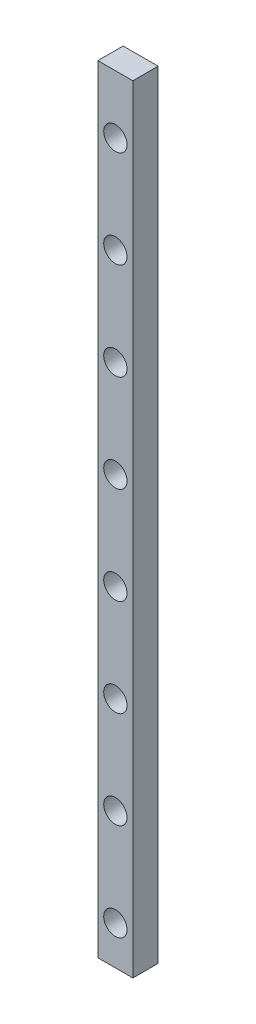
ISO-10303-21;
HEADER;
FILE_DESCRIPTION(('STEP AP214'),'2;1');
FILE_NAME('part.step','',(''),(''),'','','');
FILE_SCHEMA(('AUTOMOTIVE_DESIGN { 1 0 10303 214 1 1 1 1 }'));
ENDSEC;
DATA;
#1=APPLICATION_CONTEXT('core data for automotive mechanical design processes');
#2=APPLICATION_PROTOCOL_DEFINITION('international standard','automotive_design',2000,#1);
#3=PRODUCT_CONTEXT('',#1,'mechanical');
#4=PRODUCT('Part','Part','',(#3));
#5=PRODUCT_RELATED_PRODUCT_CATEGORY('part','',(#4));
#6=PRODUCT_DEFINITION_FORMATION('','',#4);
#7=PRODUCT_DEFINITION_CONTEXT('part definition',#1,'design');
#8=PRODUCT_DEFINITION('design','',#6,#7);
#9=PRODUCT_DEFINITION_SHAPE('','',#8);
#10=(LENGTH_UNIT() NAMED_UNIT(*) SI_UNIT(.MILLI.,.METRE.));
#11=(NAMED_UNIT(*) PLANE_ANGLE_UNIT() SI_UNIT($,.RADIAN.));
#12=(NAMED_UNIT(*) SI_UNIT($,.STERADIAN.) SOLID_ANGLE_UNIT());
#13=UNCERTAINTY_MEASURE_WITH_UNIT(LENGTH_MEASURE(1.E-05),#10,'distance_accuracy_value','');
#14=(GEOMETRIC_REPRESENTATION_CONTEXT(3) GLOBAL_UNCERTAINTY_ASSIGNED_CONTEXT((#13)) GLOBAL_UNIT_ASSIGNED_CONTEXT((#10,
#11,#12)) REPRESENTATION_CONTEXT('',''));
#15=CARTESIAN_POINT('',(0.,0.,0.));
#16=DIRECTION('',(0.,0.,1.));
#17=DIRECTION('',(1.,0.,0.));
#18=AXIS2_PLACEMENT_3D('',#15,#16,#17);
#19=CARTESIAN_POINT('',(-4.5,200.,3.25));
#20=DIRECTION('',(1.,0.,0.));
#21=DIRECTION('',(0.,0.,-1.));
#22=AXIS2_PLACEMENT_3D('',#19,#20,#21);
#23=PLANE('',#22);
#24=DIRECTION('',(0.,0.,1.));
#25=VECTOR('',#24,1.);
#26=CARTESIAN_POINT('',(-4.5,0.,3.25));
#27=LINE('',#26,#25);
#28=CARTESIAN_POINT('',(-4.5,0.,-3.25));
#29=VERTEX_POINT('',#28);
#30=CARTESIAN_POINT('',(-4.5,0.,3.25));
#31=VERTEX_POINT('',#30);
#32=EDGE_CURVE('E104',#29,#31,#27,.T.);
#33=ORIENTED_EDGE('',*,*,#32,.T.);
#34=DIRECTION('',(0.,-1.,0.));
#35=VECTOR('',#34,1.);
#36=CARTESIAN_POINT('',(-4.5,200.,3.25));
#37=LINE('',#36,#35);
#38=CARTESIAN_POINT('',(-4.5,200.,3.25));
#39=VERTEX_POINT('',#38);
#40=EDGE_CURVE('E11',#39,#31,#37,.T.);
#41=ORIENTED_EDGE('',*,*,#40,.F.);
#42=DIRECTION('',(0.,0.,1.));
#43=VECTOR('',#42,1.);
#44=CARTESIAN_POINT('',(-4.5,200.,3.25));
#45=LINE('',#44,#43);
#46=CARTESIAN_POINT('',(-4.5,200.,-3.25));
#47=VERTEX_POINT('',#46);
#48=EDGE_CURVE('E91',#47,#39,#45,.T.);
#49=ORIENTED_EDGE('',*,*,#48,.F.);
#50=DIRECTION('',(0.,-1.,0.));
#51=VECTOR('',#50,1.);
#52=CARTESIAN_POINT('',(-4.5,200.,-3.25));
#53=LINE('',#52,#51);
#54=EDGE_CURVE('E100',#47,#29,#53,.T.);
#55=ORIENTED_EDGE('',*,*,#54,.T.);
#56=EDGE_LOOP('',(#33,#41,#49,#55));
#57=FACE_BOUND('',#56,.T.);
#58=ADVANCED_FACE('F39',(#57),#23,.F.);
#59=CARTESIAN_POINT('',(4.5,200.,3.25));
#60=DIRECTION('',(0.,0.,-1.));
#61=DIRECTION('',(-1.,0.,0.));
#62=AXIS2_PLACEMENT_3D('',#59,#60,#61);
#63=PLANE('',#62);
#64=CARTESIAN_POINT('',(0.,185.,3.25));
#65=DIRECTION('',(0.,0.,1.));
#66=DIRECTION('',(1.,0.,0.));
#67=AXIS2_PLACEMENT_3D('',#64,#65,#66);
#68=CIRCLE('',#67,3.);
#69=CARTESIAN_POINT('',(3.,185.,3.25));
#70=VERTEX_POINT('',#69);
#71=EDGE_CURVE('E204',#70,#70,#68,.T.);
#72=ORIENTED_EDGE('',*,*,#71,.F.);
#73=EDGE_LOOP('',(#72));
#74=FACE_BOUND('',#73,.T.);
#75=CARTESIAN_POINT('',(0.,160.,3.25));
#76=DIRECTION('',(0.,0.,1.));
#77=DIRECTION('',(1.,0.,0.));
#78=AXIS2_PLACEMENT_3D('',#75,#76,#77);
#79=CIRCLE('',#78,3.);
#80=CARTESIAN_POINT('',(3.,160.,3.25));
#81=VERTEX_POINT('',#80);
#82=EDGE_CURVE('E192',#81,#81,#79,.T.);
#83=ORIENTED_EDGE('',*,*,#82,.F.);
#84=EDGE_LOOP('',(#83));
#85=FACE_BOUND('',#84,.T.);
#86=CARTESIAN_POINT('',(0.,135.,3.25));
#87=DIRECTION('',(0.,0.,1.));
#88=DIRECTION('',(1.,0.,0.));
#89=AXIS2_PLACEMENT_3D('',#86,#87,#88);
#90=CIRCLE('',#89,3.);
#91=CARTESIAN_POINT('',(3.,135.,3.25));
#92=VERTEX_POINT('',#91);
#93=EDGE_CURVE('E180',#92,#92,#90,.T.);
#94=ORIENTED_EDGE('',*,*,#93,.F.);
#95=EDGE_LOOP('',(#94));
#96=FACE_BOUND('',#95,.T.);
#97=CARTESIAN_POINT('',(0.,110.,3.25));
#98=DIRECTION('',(0.,0.,1.));
#99=DIRECTION('',(1.,0.,0.));
#100=AXIS2_PLACEMENT_3D('',#97,#98,#99);
#101=CIRCLE('',#100,3.);
#102=CARTESIAN_POINT('',(3.,110.,3.25));
#103=VERTEX_POINT('',#102);
#104=EDGE_CURVE('E168',#103,#103,#101,.T.);
#105=ORIENTED_EDGE('',*,*,#104,.F.);
#106=EDGE_LOOP('',(#105));
#107=FACE_BOUND('',#106,.T.);
#108=CARTESIAN_POINT('',(0.,85.,3.25));
#109=DIRECTION('',(0.,0.,1.));
#110=DIRECTION('',(1.,0.,0.));
#111=AXIS2_PLACEMENT_3D('',#108,#109,#110);
#112=CIRCLE('',#111,3.);
#113=CARTESIAN_POINT('',(3.,85.,3.25));
#114=VERTEX_POINT('',#113);
#115=EDGE_CURVE('E156',#114,#114,#112,.T.);
#116=ORIENTED_EDGE('',*,*,#115,.F.);
#117=EDGE_LOOP('',(#116));
#118=FACE_BOUND('',#117,.T.);
#119=CARTESIAN_POINT('',(0.,60.,3.25));
#120=DIRECTION('',(0.,0.,1.));
#121=DIRECTION('',(1.,0.,0.));
#122=AXIS2_PLACEMENT_3D('',#119,#120,#121);
#123=CIRCLE('',#122,3.);
#124=CARTESIAN_POINT('',(3.,60.,3.25));
#125=VERTEX_POINT('',#124);
#126=EDGE_CURVE('E144',#125,#125,#123,.T.);
#127=ORIENTED_EDGE('',*,*,#126,.F.);
#128=EDGE_LOOP('',(#127));
#129=FACE_BOUND('',#128,.T.);
#130=CARTESIAN_POINT('',(0.,35.,3.25));
#131=DIRECTION('',(0.,0.,1.));
#132=DIRECTION('',(1.,0.,0.));
#133=AXIS2_PLACEMENT_3D('',#130,#131,#132);
#134=CIRCLE('',#133,3.);
#135=CARTESIAN_POINT('',(3.,35.,3.25));
#136=VERTEX_POINT('',#135);
#137=EDGE_CURVE('E132',#136,#136,#134,.T.);
#138=ORIENTED_EDGE('',*,*,#137,.F.);
#139=EDGE_LOOP('',(#138));
#140=FACE_BOUND('',#139,.T.);
#141=CARTESIAN_POINT('',(0.,10.,3.25));
#142=DIRECTION('',(0.,0.,1.));
#143=DIRECTION('',(1.,0.,0.));
#144=AXIS2_PLACEMENT_3D('',#141,#142,#143);
#145=CIRCLE('',#144,3.);
#146=CARTESIAN_POINT('',(3.,10.,3.25));
#147=VERTEX_POINT('',#146);
#148=EDGE_CURVE('E118',#147,#147,#145,.T.);
#149=ORIENTED_EDGE('',*,*,#148,.F.);
#150=EDGE_LOOP('',(#149));
#151=FACE_BOUND('',#150,.T.);
#152=DIRECTION('',(1.,0.,0.));
#153=VECTOR('',#152,1.);
#154=CARTESIAN_POINT('',(4.5,0.,3.25));
#155=LINE('',#154,#153);
#156=CARTESIAN_POINT('',(4.5,0.,3.25));
#157=VERTEX_POINT('',#156);
#158=EDGE_CURVE('E95',#31,#157,#155,.T.);
#159=ORIENTED_EDGE('',*,*,#158,.T.);
#160=DIRECTION('',(0.,-1.,0.));
#161=VECTOR('',#160,1.);
#162=CARTESIAN_POINT('',(4.5,200.,3.25));
#163=LINE('',#162,#161);
#164=CARTESIAN_POINT('',(4.5,200.,3.25));
#165=VERTEX_POINT('',#164);
#166=EDGE_CURVE('E48',#165,#157,#163,.T.);
#167=ORIENTED_EDGE('',*,*,#166,.F.);
#168=DIRECTION('',(1.,0.,0.));
#169=VECTOR('',#168,1.);
#170=CARTESIAN_POINT('',(4.5,200.,3.25));
#171=LINE('',#170,#169);
#172=EDGE_CURVE('E86',#39,#165,#171,.T.);
#173=ORIENTED_EDGE('',*,*,#172,.F.);
#174=ORIENTED_EDGE('',*,*,#40,.T.);
#175=EDGE_LOOP('',(#159,#167,#173,#174));
#176=FACE_BOUND('',#175,.T.);
#177=ADVANCED_FACE('F94',(#74,#85,#96,#107,#118,#129,#140,#151,#176),#63,.F.);
#178=CARTESIAN_POINT('',(4.5,200.,3.25));
#179=DIRECTION('',(-1.,0.,0.));
#180=DIRECTION('',(0.,0.,1.));
#181=AXIS2_PLACEMENT_3D('',#178,#179,#180);
#182=PLANE('',#181);
#183=DIRECTION('',(0.,0.,-1.));
#184=VECTOR('',#183,1.);
#185=CARTESIAN_POINT('',(4.5,0.,3.25));
#186=LINE('',#185,#184);
#187=CARTESIAN_POINT('',(4.5,0.,-3.25));
#188=VERTEX_POINT('',#187);
#189=EDGE_CURVE('E73',#157,#188,#186,.T.);
#190=ORIENTED_EDGE('',*,*,#189,.T.);
#191=DIRECTION('',(0.,-1.,0.));
#192=VECTOR('',#191,1.);
#193=CARTESIAN_POINT('',(4.5,200.,-3.25));
#194=LINE('',#193,#192);
#195=CARTESIAN_POINT('',(4.5,200.,-3.25));
#196=VERTEX_POINT('',#195);
#197=EDGE_CURVE('E96',#196,#188,#194,.T.);
#198=ORIENTED_EDGE('',*,*,#197,.F.);
#199=DIRECTION('',(0.,0.,-1.));
#200=VECTOR('',#199,1.);
#201=CARTESIAN_POINT('',(4.5,200.,3.25));
#202=LINE('',#201,#200);
#203=EDGE_CURVE('E89',#165,#196,#202,.T.);
#204=ORIENTED_EDGE('',*,*,#203,.F.);
#205=ORIENTED_EDGE('',*,*,#166,.T.);
#206=EDGE_LOOP('',(#190,#198,#204,#205));
#207=FACE_BOUND('',#206,.T.);
#208=ADVANCED_FACE('F98',(#207),#182,.F.);
#209=CARTESIAN_POINT('',(4.5,200.,-3.25));
#210=DIRECTION('',(0.,0.,1.));
#211=DIRECTION('',(1.,0.,0.));
#212=AXIS2_PLACEMENT_3D('',#209,#210,#211);
#213=PLANE('',#212);
#214=CARTESIAN_POINT('',(0.,185.,-3.25));
#215=DIRECTION('',(0.,0.,1.));
#216=DIRECTION('',(1.,0.,0.));
#217=AXIS2_PLACEMENT_3D('',#214,#215,#216);
#218=CIRCLE('',#217,1.75);
#219=CARTESIAN_POINT('',(1.75,185.,-3.25));
#220=VERTEX_POINT('',#219);
#221=EDGE_CURVE('E207',#220,#220,#218,.T.);
#222=ORIENTED_EDGE('',*,*,#221,.T.);
#223=EDGE_LOOP('',(#222));
#224=FACE_BOUND('',#223,.T.);
#225=CARTESIAN_POINT('',(0.,160.,-3.25));
#226=DIRECTION('',(0.,0.,1.));
#227=DIRECTION('',(1.,0.,0.));
#228=AXIS2_PLACEMENT_3D('',#225,#226,#227);
#229=CIRCLE('',#228,1.75);
#230=CARTESIAN_POINT('',(1.75,160.,-3.25));
#231=VERTEX_POINT('',#230);
#232=EDGE_CURVE('E195',#231,#231,#229,.T.);
#233=ORIENTED_EDGE('',*,*,#232,.T.);
#234=EDGE_LOOP('',(#233));
#235=FACE_BOUND('',#234,.T.);
#236=CARTESIAN_POINT('',(0.,135.,-3.25));
#237=DIRECTION('',(0.,0.,1.));
#238=DIRECTION('',(1.,0.,0.));
#239=AXIS2_PLACEMENT_3D('',#236,#237,#238);
#240=CIRCLE('',#239,1.75);
#241=CARTESIAN_POINT('',(1.75,135.,-3.25));
#242=VERTEX_POINT('',#241);
#243=EDGE_CURVE('E183',#242,#242,#240,.T.);
#244=ORIENTED_EDGE('',*,*,#243,.T.);
#245=EDGE_LOOP('',(#244));
#246=FACE_BOUND('',#245,.T.);
#247=CARTESIAN_POINT('',(0.,110.,-3.25));
#248=DIRECTION('',(0.,0.,1.));
#249=DIRECTION('',(1.,0.,0.));
#250=AXIS2_PLACEMENT_3D('',#247,#248,#249);
#251=CIRCLE('',#250,1.75);
#252=CARTESIAN_POINT('',(1.75,110.,-3.25));
#253=VERTEX_POINT('',#252);
#254=EDGE_CURVE('E171',#253,#253,#251,.T.);
#255=ORIENTED_EDGE('',*,*,#254,.T.);
#256=EDGE_LOOP('',(#255));
#257=FACE_BOUND('',#256,.T.);
#258=CARTESIAN_POINT('',(0.,85.,-3.25));
#259=DIRECTION('',(0.,0.,1.));
#260=DIRECTION('',(1.,0.,0.));
#261=AXIS2_PLACEMENT_3D('',#258,#259,#260);
#262=CIRCLE('',#261,1.75);
#263=CARTESIAN_POINT('',(1.75,85.,-3.25));
#264=VERTEX_POINT('',#263);
#265=EDGE_CURVE('E159',#264,#264,#262,.T.);
#266=ORIENTED_EDGE('',*,*,#265,.T.);
#267=EDGE_LOOP('',(#266));
#268=FACE_BOUND('',#267,.T.);
#269=CARTESIAN_POINT('',(0.,60.,-3.25));
#270=DIRECTION('',(0.,0.,1.));
#271=DIRECTION('',(1.,0.,0.));
#272=AXIS2_PLACEMENT_3D('',#269,#270,#271);
#273=CIRCLE('',#272,1.75);
#274=CARTESIAN_POINT('',(1.75,60.,-3.25));
#275=VERTEX_POINT('',#274);
#276=EDGE_CURVE('E147',#275,#275,#273,.T.);
#277=ORIENTED_EDGE('',*,*,#276,.T.);
#278=EDGE_LOOP('',(#277));
#279=FACE_BOUND('',#278,.T.);
#280=CARTESIAN_POINT('',(0.,35.,-3.25));
#281=DIRECTION('',(0.,0.,1.));
#282=DIRECTION('',(1.,0.,0.));
#283=AXIS2_PLACEMENT_3D('',#280,#281,#282);
#284=CIRCLE('',#283,1.75);
#285=CARTESIAN_POINT('',(1.75,35.,-3.25));
#286=VERTEX_POINT('',#285);
#287=EDGE_CURVE('E135',#286,#286,#284,.T.);
#288=ORIENTED_EDGE('',*,*,#287,.T.);
#289=EDGE_LOOP('',(#288));
#290=FACE_BOUND('',#289,.T.);
#291=CARTESIAN_POINT('',(0.,10.,-3.25));
#292=DIRECTION('',(0.,0.,1.));
#293=DIRECTION('',(1.,0.,0.));
#294=AXIS2_PLACEMENT_3D('',#291,#292,#293);
#295=CIRCLE('',#294,1.75);
#296=CARTESIAN_POINT('',(1.75,10.,-3.25));
#297=VERTEX_POINT('',#296);
#298=EDGE_CURVE('E42',#297,#297,#295,.T.);
#299=ORIENTED_EDGE('',*,*,#298,.T.);
#300=EDGE_LOOP('',(#299));
#301=FACE_BOUND('',#300,.T.);
#302=DIRECTION('',(-1.,0.,0.));
#303=VECTOR('',#302,1.);
#304=CARTESIAN_POINT('',(4.5,0.,-3.25));
#305=LINE('',#304,#303);
#306=EDGE_CURVE('E79',#188,#29,#305,.T.);
#307=ORIENTED_EDGE('',*,*,#306,.T.);
#308=ORIENTED_EDGE('',*,*,#54,.F.);
#309=DIRECTION('',(-1.,0.,0.));
#310=VECTOR('',#309,1.);
#311=CARTESIAN_POINT('',(4.5,200.,-3.25));
#312=LINE('',#311,#310);
#313=EDGE_CURVE('E56',#196,#47,#312,.T.);
#314=ORIENTED_EDGE('',*,*,#313,.F.);
#315=ORIENTED_EDGE('',*,*,#197,.T.);
#316=EDGE_LOOP('',(#307,#308,#314,#315));
#317=FACE_BOUND('',#316,.T.);
#318=ADVANCED_FACE('F112',(#224,#235,#246,#257,#268,#279,#290,#301,#317),#213,.F.);
#319=CARTESIAN_POINT('',(0.,200.,0.));
#320=DIRECTION('',(0.,1.,0.));
#321=DIRECTION('',(0.,0.,1.));
#322=AXIS2_PLACEMENT_3D('',#319,#320,#321);
#323=PLANE('',#322);
#324=ORIENTED_EDGE('',*,*,#48,.T.);
#325=ORIENTED_EDGE('',*,*,#172,.T.);
#326=ORIENTED_EDGE('',*,*,#203,.T.);
#327=ORIENTED_EDGE('',*,*,#313,.T.);
#328=EDGE_LOOP('',(#324,#325,#326,#327));
#329=FACE_BOUND('',#328,.T.);
#330=ADVANCED_FACE('F87',(#329),#323,.T.);
#331=CARTESIAN_POINT('',(0.,0.,0.));
#332=DIRECTION('',(0.,1.,0.));
#333=DIRECTION('',(0.,0.,1.));
#334=AXIS2_PLACEMENT_3D('',#331,#332,#333);
#335=PLANE('',#334);
#336=ORIENTED_EDGE('',*,*,#32,.F.);
#337=ORIENTED_EDGE('',*,*,#306,.F.);
#338=ORIENTED_EDGE('',*,*,#189,.F.);
#339=ORIENTED_EDGE('',*,*,#158,.F.);
#340=EDGE_LOOP('',(#336,#337,#338,#339));
#341=FACE_BOUND('',#340,.T.);
#342=ADVANCED_FACE('F115',(#341),#335,.F.);
#343=CARTESIAN_POINT('',(0.,10.,-1.25));
#344=DIRECTION('',(0.,0.,1.));
#345=DIRECTION('',(1.,0.,0.));
#346=AXIS2_PLACEMENT_3D('',#343,#344,#345);
#347=CYLINDRICAL_SURFACE('',#346,3.);
#348=CARTESIAN_POINT('',(0.,10.,-1.25));
#349=DIRECTION('',(0.,0.,1.));
#350=DIRECTION('',(1.,0.,0.));
#351=AXIS2_PLACEMENT_3D('',#348,#349,#350);
#352=CIRCLE('',#351,3.);
#353=CARTESIAN_POINT('',(3.,10.,-1.25));
#354=VERTEX_POINT('',#353);
#355=EDGE_CURVE('E107',#354,#354,#352,.T.);
#356=ORIENTED_EDGE('',*,*,#355,.F.);
#357=EDGE_LOOP('',(#356));
#358=FACE_BOUND('',#357,.T.);
#359=ORIENTED_EDGE('',*,*,#148,.T.);
#360=EDGE_LOOP('',(#359));
#361=FACE_BOUND('',#360,.T.);
#362=ADVANCED_FACE('F241',(#358,#361),#347,.F.);
#363=CARTESIAN_POINT('',(0.,10.,-1.25));
#364=DIRECTION('',(0.,0.,1.));
#365=DIRECTION('',(1.,0.,0.));
#366=AXIS2_PLACEMENT_3D('',#363,#364,#365);
#367=PLANE('',#366);
#368=CARTESIAN_POINT('',(0.,10.,-1.25));
#369=DIRECTION('',(0.,0.,1.));
#370=DIRECTION('',(1.,0.,0.));
#371=AXIS2_PLACEMENT_3D('',#368,#369,#370);
#372=CIRCLE('',#371,1.75);
#373=CARTESIAN_POINT('',(1.75,10.,-1.25));
#374=VERTEX_POINT('',#373);
#375=EDGE_CURVE('E123',#374,#374,#372,.T.);
#376=ORIENTED_EDGE('',*,*,#375,.F.);
#377=EDGE_LOOP('',(#376));
#378=FACE_BOUND('',#377,.T.);
#379=ORIENTED_EDGE('',*,*,#355,.T.);
#380=EDGE_LOOP('',(#379));
#381=FACE_BOUND('',#380,.T.);
#382=ADVANCED_FACE('F246',(#378,#381),#367,.T.);
#383=CARTESIAN_POINT('',(0.,10.,-5.75));
#384=DIRECTION('',(0.,0.,1.));
#385=DIRECTION('',(1.,0.,0.));
#386=AXIS2_PLACEMENT_3D('',#383,#384,#385);
#387=CYLINDRICAL_SURFACE('',#386,1.75);
#388=ORIENTED_EDGE('',*,*,#375,.T.);
#389=EDGE_LOOP('',(#388));
#390=FACE_BOUND('',#389,.T.);
#391=ORIENTED_EDGE('',*,*,#298,.F.);
#392=EDGE_LOOP('',(#391));
#393=FACE_BOUND('',#392,.T.);
#394=ADVANCED_FACE('F250',(#390,#393),#387,.F.);
#395=CARTESIAN_POINT('',(0.,35.,-1.25));
#396=DIRECTION('',(0.,0.,1.));
#397=DIRECTION('',(1.,0.,0.));
#398=AXIS2_PLACEMENT_3D('',#395,#396,#397);
#399=CYLINDRICAL_SURFACE('',#398,3.);
#400=CARTESIAN_POINT('',(0.,35.,-1.25));
#401=DIRECTION('',(0.,0.,1.));
#402=DIRECTION('',(1.,0.,0.));
#403=AXIS2_PLACEMENT_3D('',#400,#401,#402);
#404=CIRCLE('',#403,3.);
#405=CARTESIAN_POINT('',(3.,35.,-1.25));
#406=VERTEX_POINT('',#405);
#407=EDGE_CURVE('E126',#406,#406,#404,.T.);
#408=ORIENTED_EDGE('',*,*,#407,.F.);
#409=EDGE_LOOP('',(#408));
#410=FACE_BOUND('',#409,.T.);
#411=ORIENTED_EDGE('',*,*,#137,.T.);
#412=EDGE_LOOP('',(#411));
#413=FACE_BOUND('',#412,.T.);
#414=ADVANCED_FACE('F253',(#410,#413),#399,.F.);
#415=CARTESIAN_POINT('',(0.,35.,-1.25));
#416=DIRECTION('',(0.,0.,1.));
#417=DIRECTION('',(1.,0.,0.));
#418=AXIS2_PLACEMENT_3D('',#415,#416,#417);
#419=PLANE('',#418);
#420=CARTESIAN_POINT('',(0.,35.,-1.25));
#421=DIRECTION('',(0.,0.,1.));
#422=DIRECTION('',(1.,0.,0.));
#423=AXIS2_PLACEMENT_3D('',#420,#421,#422);
#424=CIRCLE('',#423,1.75);
#425=CARTESIAN_POINT('',(1.75,35.,-1.25));
#426=VERTEX_POINT('',#425);
#427=EDGE_CURVE('E129',#426,#426,#424,.T.);
#428=ORIENTED_EDGE('',*,*,#427,.F.);
#429=EDGE_LOOP('',(#428));
#430=FACE_BOUND('',#429,.T.);
#431=ORIENTED_EDGE('',*,*,#407,.T.);
#432=EDGE_LOOP('',(#431));
#433=FACE_BOUND('',#432,.T.);
#434=ADVANCED_FACE('F257',(#430,#433),#419,.T.);
#435=CARTESIAN_POINT('',(0.,35.,-5.75));
#436=DIRECTION('',(0.,0.,1.));
#437=DIRECTION('',(1.,0.,0.));
#438=AXIS2_PLACEMENT_3D('',#435,#436,#437);
#439=CYLINDRICAL_SURFACE('',#438,1.75);
#440=ORIENTED_EDGE('',*,*,#427,.T.);
#441=EDGE_LOOP('',(#440));
#442=FACE_BOUND('',#441,.T.);
#443=ORIENTED_EDGE('',*,*,#287,.F.);
#444=EDGE_LOOP('',(#443));
#445=FACE_BOUND('',#444,.T.);
#446=ADVANCED_FACE('F261',(#442,#445),#439,.F.);
#447=CARTESIAN_POINT('',(0.,60.,-1.25));
#448=DIRECTION('',(0.,0.,1.));
#449=DIRECTION('',(1.,0.,0.));
#450=AXIS2_PLACEMENT_3D('',#447,#448,#449);
#451=CYLINDRICAL_SURFACE('',#450,3.);
#452=CARTESIAN_POINT('',(0.,60.,-1.25));
#453=DIRECTION('',(0.,0.,1.));
#454=DIRECTION('',(1.,0.,0.));
#455=AXIS2_PLACEMENT_3D('',#452,#453,#454);
#456=CIRCLE('',#455,3.);
#457=CARTESIAN_POINT('',(3.,60.,-1.25));
#458=VERTEX_POINT('',#457);
#459=EDGE_CURVE('E138',#458,#458,#456,.T.);
#460=ORIENTED_EDGE('',*,*,#459,.F.);
#461=EDGE_LOOP('',(#460));
#462=FACE_BOUND('',#461,.T.);
#463=ORIENTED_EDGE('',*,*,#126,.T.);
#464=EDGE_LOOP('',(#463));
#465=FACE_BOUND('',#464,.T.);
#466=ADVANCED_FACE('F265',(#462,#465),#451,.F.);
#467=CARTESIAN_POINT('',(0.,60.,-1.25));
#468=DIRECTION('',(0.,0.,1.));
#469=DIRECTION('',(1.,0.,0.));
#470=AXIS2_PLACEMENT_3D('',#467,#468,#469);
#471=PLANE('',#470);
#472=CARTESIAN_POINT('',(0.,60.,-1.25));
#473=DIRECTION('',(0.,0.,1.));
#474=DIRECTION('',(1.,0.,0.));
#475=AXIS2_PLACEMENT_3D('',#472,#473,#474);
#476=CIRCLE('',#475,1.75);
#477=CARTESIAN_POINT('',(1.75,60.,-1.25));
#478=VERTEX_POINT('',#477);
#479=EDGE_CURVE('E141',#478,#478,#476,.T.);
#480=ORIENTED_EDGE('',*,*,#479,.F.);
#481=EDGE_LOOP('',(#480));
#482=FACE_BOUND('',#481,.T.);
#483=ORIENTED_EDGE('',*,*,#459,.T.);
#484=EDGE_LOOP('',(#483));
#485=FACE_BOUND('',#484,.T.);
#486=ADVANCED_FACE('F269',(#482,#485),#471,.T.);
#487=CARTESIAN_POINT('',(0.,60.,-5.75));
#488=DIRECTION('',(0.,0.,1.));
#489=DIRECTION('',(1.,0.,0.));
#490=AXIS2_PLACEMENT_3D('',#487,#488,#489);
#491=CYLINDRICAL_SURFACE('',#490,1.75);
#492=ORIENTED_EDGE('',*,*,#479,.T.);
#493=EDGE_LOOP('',(#492));
#494=FACE_BOUND('',#493,.T.);
#495=ORIENTED_EDGE('',*,*,#276,.F.);
#496=EDGE_LOOP('',(#495));
#497=FACE_BOUND('',#496,.T.);
#498=ADVANCED_FACE('F273',(#494,#497),#491,.F.);
#499=CARTESIAN_POINT('',(0.,85.,-1.25));
#500=DIRECTION('',(0.,0.,1.));
#501=DIRECTION('',(1.,0.,0.));
#502=AXIS2_PLACEMENT_3D('',#499,#500,#501);
#503=CYLINDRICAL_SURFACE('',#502,3.);
#504=CARTESIAN_POINT('',(0.,85.,-1.25));
#505=DIRECTION('',(0.,0.,1.));
#506=DIRECTION('',(1.,0.,0.));
#507=AXIS2_PLACEMENT_3D('',#504,#505,#506);
#508=CIRCLE('',#507,3.);
#509=CARTESIAN_POINT('',(3.,85.,-1.25));
#510=VERTEX_POINT('',#509);
#511=EDGE_CURVE('E150',#510,#510,#508,.T.);
#512=ORIENTED_EDGE('',*,*,#511,.F.);
#513=EDGE_LOOP('',(#512));
#514=FACE_BOUND('',#513,.T.);
#515=ORIENTED_EDGE('',*,*,#115,.T.);
#516=EDGE_LOOP('',(#515));
#517=FACE_BOUND('',#516,.T.);
#518=ADVANCED_FACE('F277',(#514,#517),#503,.F.);
#519=CARTESIAN_POINT('',(0.,85.,-1.25));
#520=DIRECTION('',(0.,0.,1.));
#521=DIRECTION('',(1.,0.,0.));
#522=AXIS2_PLACEMENT_3D('',#519,#520,#521);
#523=PLANE('',#522);
#524=CARTESIAN_POINT('',(0.,85.,-1.25));
#525=DIRECTION('',(0.,0.,1.));
#526=DIRECTION('',(1.,0.,0.));
#527=AXIS2_PLACEMENT_3D('',#524,#525,#526);
#528=CIRCLE('',#527,1.75);
#529=CARTESIAN_POINT('',(1.75,85.,-1.25));
#530=VERTEX_POINT('',#529);
#531=EDGE_CURVE('E153',#530,#530,#528,.T.);
#532=ORIENTED_EDGE('',*,*,#531,.F.);
#533=EDGE_LOOP('',(#532));
#534=FACE_BOUND('',#533,.T.);
#535=ORIENTED_EDGE('',*,*,#511,.T.);
#536=EDGE_LOOP('',(#535));
#537=FACE_BOUND('',#536,.T.);
#538=ADVANCED_FACE('F281',(#534,#537),#523,.T.);
#539=CARTESIAN_POINT('',(0.,85.,-5.75));
#540=DIRECTION('',(0.,0.,1.));
#541=DIRECTION('',(1.,0.,0.));
#542=AXIS2_PLACEMENT_3D('',#539,#540,#541);
#543=CYLINDRICAL_SURFACE('',#542,1.75);
#544=ORIENTED_EDGE('',*,*,#531,.T.);
#545=EDGE_LOOP('',(#544));
#546=FACE_BOUND('',#545,.T.);
#547=ORIENTED_EDGE('',*,*,#265,.F.);
#548=EDGE_LOOP('',(#547));
#549=FACE_BOUND('',#548,.T.);
#550=ADVANCED_FACE('F285',(#546,#549),#543,.F.);
#551=CARTESIAN_POINT('',(0.,110.,-1.25));
#552=DIRECTION('',(0.,0.,1.));
#553=DIRECTION('',(1.,0.,0.));
#554=AXIS2_PLACEMENT_3D('',#551,#552,#553);
#555=CYLINDRICAL_SURFACE('',#554,3.);
#556=CARTESIAN_POINT('',(0.,110.,-1.25));
#557=DIRECTION('',(0.,0.,1.));
#558=DIRECTION('',(1.,0.,0.));
#559=AXIS2_PLACEMENT_3D('',#556,#557,#558);
#560=CIRCLE('',#559,3.);
#561=CARTESIAN_POINT('',(3.,110.,-1.25));
#562=VERTEX_POINT('',#561);
#563=EDGE_CURVE('E162',#562,#562,#560,.T.);
#564=ORIENTED_EDGE('',*,*,#563,.F.);
#565=EDGE_LOOP('',(#564));
#566=FACE_BOUND('',#565,.T.);
#567=ORIENTED_EDGE('',*,*,#104,.T.);
#568=EDGE_LOOP('',(#567));
#569=FACE_BOUND('',#568,.T.);
#570=ADVANCED_FACE('F289',(#566,#569),#555,.F.);
#571=CARTESIAN_POINT('',(0.,110.,-1.25));
#572=DIRECTION('',(0.,0.,1.));
#573=DIRECTION('',(1.,0.,0.));
#574=AXIS2_PLACEMENT_3D('',#571,#572,#573);
#575=PLANE('',#574);
#576=CARTESIAN_POINT('',(0.,110.,-1.25));
#577=DIRECTION('',(0.,0.,1.));
#578=DIRECTION('',(1.,0.,0.));
#579=AXIS2_PLACEMENT_3D('',#576,#577,#578);
#580=CIRCLE('',#579,1.75);
#581=CARTESIAN_POINT('',(1.75,110.,-1.25));
#582=VERTEX_POINT('',#581);
#583=EDGE_CURVE('E165',#582,#582,#580,.T.);
#584=ORIENTED_EDGE('',*,*,#583,.F.);
#585=EDGE_LOOP('',(#584));
#586=FACE_BOUND('',#585,.T.);
#587=ORIENTED_EDGE('',*,*,#563,.T.);
#588=EDGE_LOOP('',(#587));
#589=FACE_BOUND('',#588,.T.);
#590=ADVANCED_FACE('F293',(#586,#589),#575,.T.);
#591=CARTESIAN_POINT('',(0.,110.,-5.75));
#592=DIRECTION('',(0.,0.,1.));
#593=DIRECTION('',(1.,0.,0.));
#594=AXIS2_PLACEMENT_3D('',#591,#592,#593);
#595=CYLINDRICAL_SURFACE('',#594,1.75);
#596=ORIENTED_EDGE('',*,*,#583,.T.);
#597=EDGE_LOOP('',(#596));
#598=FACE_BOUND('',#597,.T.);
#599=ORIENTED_EDGE('',*,*,#254,.F.);
#600=EDGE_LOOP('',(#599));
#601=FACE_BOUND('',#600,.T.);
#602=ADVANCED_FACE('F297',(#598,#601),#595,.F.);
#603=CARTESIAN_POINT('',(0.,135.,-1.25));
#604=DIRECTION('',(0.,0.,1.));
#605=DIRECTION('',(1.,0.,0.));
#606=AXIS2_PLACEMENT_3D('',#603,#604,#605);
#607=CYLINDRICAL_SURFACE('',#606,3.);
#608=CARTESIAN_POINT('',(0.,135.,-1.25));
#609=DIRECTION('',(0.,0.,1.));
#610=DIRECTION('',(1.,0.,0.));
#611=AXIS2_PLACEMENT_3D('',#608,#609,#610);
#612=CIRCLE('',#611,3.);
#613=CARTESIAN_POINT('',(3.,135.,-1.25));
#614=VERTEX_POINT('',#613);
#615=EDGE_CURVE('E174',#614,#614,#612,.T.);
#616=ORIENTED_EDGE('',*,*,#615,.F.);
#617=EDGE_LOOP('',(#616));
#618=FACE_BOUND('',#617,.T.);
#619=ORIENTED_EDGE('',*,*,#93,.T.);
#620=EDGE_LOOP('',(#619));
#621=FACE_BOUND('',#620,.T.);
#622=ADVANCED_FACE('F301',(#618,#621),#607,.F.);
#623=CARTESIAN_POINT('',(0.,135.,-1.25));
#624=DIRECTION('',(0.,0.,1.));
#625=DIRECTION('',(1.,0.,0.));
#626=AXIS2_PLACEMENT_3D('',#623,#624,#625);
#627=PLANE('',#626);
#628=CARTESIAN_POINT('',(0.,135.,-1.25));
#629=DIRECTION('',(0.,0.,1.));
#630=DIRECTION('',(1.,0.,0.));
#631=AXIS2_PLACEMENT_3D('',#628,#629,#630);
#632=CIRCLE('',#631,1.75);
#633=CARTESIAN_POINT('',(1.75,135.,-1.25));
#634=VERTEX_POINT('',#633);
#635=EDGE_CURVE('E177',#634,#634,#632,.T.);
#636=ORIENTED_EDGE('',*,*,#635,.F.);
#637=EDGE_LOOP('',(#636));
#638=FACE_BOUND('',#637,.T.);
#639=ORIENTED_EDGE('',*,*,#615,.T.);
#640=EDGE_LOOP('',(#639));
#641=FACE_BOUND('',#640,.T.);
#642=ADVANCED_FACE('F305',(#638,#641),#627,.T.);
#643=CARTESIAN_POINT('',(0.,135.,-5.75));
#644=DIRECTION('',(0.,0.,1.));
#645=DIRECTION('',(1.,0.,0.));
#646=AXIS2_PLACEMENT_3D('',#643,#644,#645);
#647=CYLINDRICAL_SURFACE('',#646,1.75);
#648=ORIENTED_EDGE('',*,*,#635,.T.);
#649=EDGE_LOOP('',(#648));
#650=FACE_BOUND('',#649,.T.);
#651=ORIENTED_EDGE('',*,*,#243,.F.);
#652=EDGE_LOOP('',(#651));
#653=FACE_BOUND('',#652,.T.);
#654=ADVANCED_FACE('F309',(#650,#653),#647,.F.);
#655=CARTESIAN_POINT('',(0.,160.,-1.25));
#656=DIRECTION('',(0.,0.,1.));
#657=DIRECTION('',(1.,0.,0.));
#658=AXIS2_PLACEMENT_3D('',#655,#656,#657);
#659=CYLINDRICAL_SURFACE('',#658,3.);
#660=CARTESIAN_POINT('',(0.,160.,-1.25));
#661=DIRECTION('',(0.,0.,1.));
#662=DIRECTION('',(1.,0.,0.));
#663=AXIS2_PLACEMENT_3D('',#660,#661,#662);
#664=CIRCLE('',#663,3.);
#665=CARTESIAN_POINT('',(3.,160.,-1.25));
#666=VERTEX_POINT('',#665);
#667=EDGE_CURVE('E186',#666,#666,#664,.T.);
#668=ORIENTED_EDGE('',*,*,#667,.F.);
#669=EDGE_LOOP('',(#668));
#670=FACE_BOUND('',#669,.T.);
#671=ORIENTED_EDGE('',*,*,#82,.T.);
#672=EDGE_LOOP('',(#671));
#673=FACE_BOUND('',#672,.T.);
#674=ADVANCED_FACE('F313',(#670,#673),#659,.F.);
#675=CARTESIAN_POINT('',(0.,160.,-1.25));
#676=DIRECTION('',(0.,0.,1.));
#677=DIRECTION('',(1.,0.,0.));
#678=AXIS2_PLACEMENT_3D('',#675,#676,#677);
#679=PLANE('',#678);
#680=CARTESIAN_POINT('',(0.,160.,-1.25));
#681=DIRECTION('',(0.,0.,1.));
#682=DIRECTION('',(1.,0.,0.));
#683=AXIS2_PLACEMENT_3D('',#680,#681,#682);
#684=CIRCLE('',#683,1.75);
#685=CARTESIAN_POINT('',(1.75,160.,-1.25));
#686=VERTEX_POINT('',#685);
#687=EDGE_CURVE('E189',#686,#686,#684,.T.);
#688=ORIENTED_EDGE('',*,*,#687,.F.);
#689=EDGE_LOOP('',(#688));
#690=FACE_BOUND('',#689,.T.);
#691=ORIENTED_EDGE('',*,*,#667,.T.);
#692=EDGE_LOOP('',(#691));
#693=FACE_BOUND('',#692,.T.);
#694=ADVANCED_FACE('F317',(#690,#693),#679,.T.);
#695=CARTESIAN_POINT('',(0.,160.,-5.75));
#696=DIRECTION('',(0.,0.,1.));
#697=DIRECTION('',(1.,0.,0.));
#698=AXIS2_PLACEMENT_3D('',#695,#696,#697);
#699=CYLINDRICAL_SURFACE('',#698,1.75);
#700=ORIENTED_EDGE('',*,*,#687,.T.);
#701=EDGE_LOOP('',(#700));
#702=FACE_BOUND('',#701,.T.);
#703=ORIENTED_EDGE('',*,*,#232,.F.);
#704=EDGE_LOOP('',(#703));
#705=FACE_BOUND('',#704,.T.);
#706=ADVANCED_FACE('F321',(#702,#705),#699,.F.);
#707=CARTESIAN_POINT('',(0.,185.,-1.25));
#708=DIRECTION('',(0.,0.,1.));
#709=DIRECTION('',(1.,0.,0.));
#710=AXIS2_PLACEMENT_3D('',#707,#708,#709);
#711=CYLINDRICAL_SURFACE('',#710,3.);
#712=CARTESIAN_POINT('',(0.,185.,-1.25));
#713=DIRECTION('',(0.,0.,1.));
#714=DIRECTION('',(1.,0.,0.));
#715=AXIS2_PLACEMENT_3D('',#712,#713,#714);
#716=CIRCLE('',#715,3.);
#717=CARTESIAN_POINT('',(3.,185.,-1.25));
#718=VERTEX_POINT('',#717);
#719=EDGE_CURVE('E198',#718,#718,#716,.T.);
#720=ORIENTED_EDGE('',*,*,#719,.F.);
#721=EDGE_LOOP('',(#720));
#722=FACE_BOUND('',#721,.T.);
#723=ORIENTED_EDGE('',*,*,#71,.T.);
#724=EDGE_LOOP('',(#723));
#725=FACE_BOUND('',#724,.T.);
#726=ADVANCED_FACE('F221',(#722,#725),#711,.F.);
#727=CARTESIAN_POINT('',(0.,185.,-1.25));
#728=DIRECTION('',(0.,0.,1.));
#729=DIRECTION('',(1.,0.,0.));
#730=AXIS2_PLACEMENT_3D('',#727,#728,#729);
#731=PLANE('',#730);
#732=CARTESIAN_POINT('',(0.,185.,-1.25));
#733=DIRECTION('',(0.,0.,1.));
#734=DIRECTION('',(1.,0.,0.));
#735=AXIS2_PLACEMENT_3D('',#732,#733,#734);
#736=CIRCLE('',#735,1.75);
#737=CARTESIAN_POINT('',(1.75,185.,-1.25));
#738=VERTEX_POINT('',#737);
#739=EDGE_CURVE('E201',#738,#738,#736,.T.);
#740=ORIENTED_EDGE('',*,*,#739,.F.);
#741=EDGE_LOOP('',(#740));
#742=FACE_BOUND('',#741,.T.);
#743=ORIENTED_EDGE('',*,*,#719,.T.);
#744=EDGE_LOOP('',(#743));
#745=FACE_BOUND('',#744,.T.);
#746=ADVANCED_FACE('F215',(#742,#745),#731,.T.);
#747=CARTESIAN_POINT('',(0.,185.,-5.75));
#748=DIRECTION('',(0.,0.,1.));
#749=DIRECTION('',(1.,0.,0.));
#750=AXIS2_PLACEMENT_3D('',#747,#748,#749);
#751=CYLINDRICAL_SURFACE('',#750,1.75);
#752=ORIENTED_EDGE('',*,*,#739,.T.);
#753=EDGE_LOOP('',(#752));
#754=FACE_BOUND('',#753,.T.);
#755=ORIENTED_EDGE('',*,*,#221,.F.);
#756=EDGE_LOOP('',(#755));
#757=FACE_BOUND('',#756,.T.);
#758=ADVANCED_FACE('F213',(#754,#757),#751,.F.);
#759=CLOSED_SHELL('',(#58,#177,#208,#318,#330,#342,#362,#382,#394,#414,#434,#446,#466,#486,#498,
#518,#538,#550,#570,#590,#602,#622,#642,#654,#674,#694,#706,#726,#746,#758));
#760=MANIFOLD_SOLID_BREP('B2',#759);
#761=ADVANCED_BREP_SHAPE_REPRESENTATION('',(#18,#760),#14);
#762=SHAPE_DEFINITION_REPRESENTATION(#9,#761);
ENDSEC;
END-ISO-10303-21;
